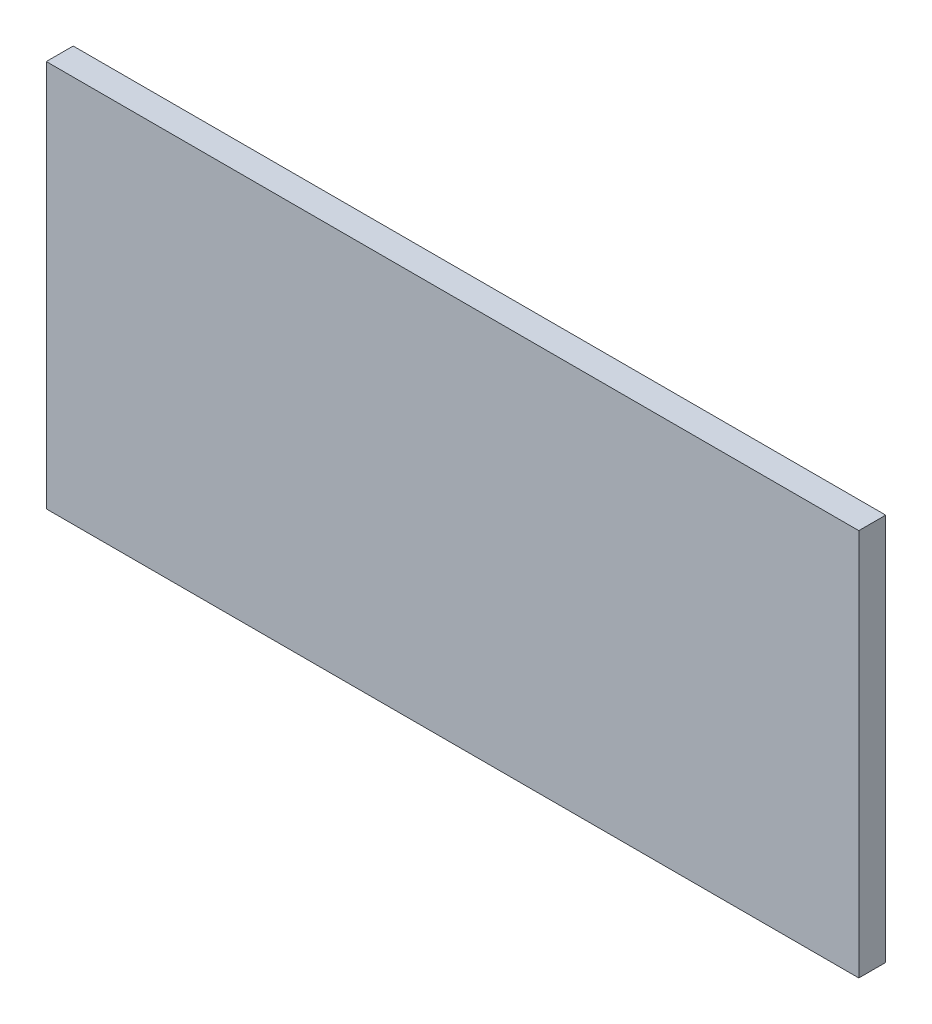
ISO-10303-21;
HEADER;
FILE_DESCRIPTION(('STEP AP214'),'2;1');
FILE_NAME('part.step','',(''),(''),'','','');
FILE_SCHEMA(('AUTOMOTIVE_DESIGN { 1 0 10303 214 1 1 1 1 }'));
ENDSEC;
DATA;
#1=APPLICATION_CONTEXT('core data for automotive mechanical design processes');
#2=APPLICATION_PROTOCOL_DEFINITION('international standard','automotive_design',2000,#1);
#3=PRODUCT_CONTEXT('',#1,'mechanical');
#4=PRODUCT('Part','Part','',(#3));
#5=PRODUCT_RELATED_PRODUCT_CATEGORY('part','',(#4));
#6=PRODUCT_DEFINITION_FORMATION('','',#4);
#7=PRODUCT_DEFINITION_CONTEXT('part definition',#1,'design');
#8=PRODUCT_DEFINITION('design','',#6,#7);
#9=PRODUCT_DEFINITION_SHAPE('','',#8);
#10=(LENGTH_UNIT() NAMED_UNIT(*) SI_UNIT(.MILLI.,.METRE.));
#11=(NAMED_UNIT(*) PLANE_ANGLE_UNIT() SI_UNIT($,.RADIAN.));
#12=(NAMED_UNIT(*) SI_UNIT($,.STERADIAN.) SOLID_ANGLE_UNIT());
#13=UNCERTAINTY_MEASURE_WITH_UNIT(LENGTH_MEASURE(1.E-05),#10,'distance_accuracy_value','');
#14=(GEOMETRIC_REPRESENTATION_CONTEXT(3) GLOBAL_UNCERTAINTY_ASSIGNED_CONTEXT((#13)) GLOBAL_UNIT_ASSIGNED_CONTEXT((#10,
#11,#12)) REPRESENTATION_CONTEXT('',''));
#15=CARTESIAN_POINT('',(0.,0.,0.));
#16=DIRECTION('',(0.,0.,1.));
#17=DIRECTION('',(1.,0.,0.));
#18=AXIS2_PLACEMENT_3D('',#15,#16,#17);
#19=CARTESIAN_POINT('',(-75.5,36.,5.));
#20=DIRECTION('',(1.,0.,0.));
#21=DIRECTION('',(0.,1.,0.));
#22=AXIS2_PLACEMENT_3D('',#19,#20,#21);
#23=PLANE('',#22);
#24=DIRECTION('',(0.,-1.,0.));
#25=VECTOR('',#24,1.);
#26=CARTESIAN_POINT('',(-75.5,36.,0.));
#27=LINE('',#26,#25);
#28=CARTESIAN_POINT('',(-75.5,36.,0.));
#29=VERTEX_POINT('',#28);
#30=CARTESIAN_POINT('',(-75.5,-36.,0.));
#31=VERTEX_POINT('',#30);
#32=EDGE_CURVE('E96',#29,#31,#27,.T.);
#33=ORIENTED_EDGE('',*,*,#32,.T.);
#34=DIRECTION('',(0.,0.,-1.));
#35=VECTOR('',#34,1.);
#36=CARTESIAN_POINT('',(-75.5,-36.,5.));
#37=LINE('',#36,#35);
#38=CARTESIAN_POINT('',(-75.5,-36.,5.));
#39=VERTEX_POINT('',#38);
#40=EDGE_CURVE('E11',#39,#31,#37,.T.);
#41=ORIENTED_EDGE('',*,*,#40,.F.);
#42=DIRECTION('',(0.,-1.,0.));
#43=VECTOR('',#42,1.);
#44=CARTESIAN_POINT('',(-75.5,36.,5.));
#45=LINE('',#44,#43);
#46=CARTESIAN_POINT('',(-75.5,36.,5.));
#47=VERTEX_POINT('',#46);
#48=EDGE_CURVE('E84',#47,#39,#45,.T.);
#49=ORIENTED_EDGE('',*,*,#48,.F.);
#50=DIRECTION('',(0.,0.,-1.));
#51=VECTOR('',#50,1.);
#52=CARTESIAN_POINT('',(-75.5,36.,5.));
#53=LINE('',#52,#51);
#54=EDGE_CURVE('E92',#47,#29,#53,.T.);
#55=ORIENTED_EDGE('',*,*,#54,.T.);
#56=EDGE_LOOP('',(#33,#41,#49,#55));
#57=FACE_BOUND('',#56,.T.);
#58=ADVANCED_FACE('F33',(#57),#23,.F.);
#59=CARTESIAN_POINT('',(-75.5,-36.,5.));
#60=DIRECTION('',(0.,1.,0.));
#61=DIRECTION('',(0.,0.,1.));
#62=AXIS2_PLACEMENT_3D('',#59,#60,#61);
#63=PLANE('',#62);
#64=DIRECTION('',(1.,0.,0.));
#65=VECTOR('',#64,1.);
#66=CARTESIAN_POINT('',(-75.5,-36.,0.));
#67=LINE('',#66,#65);
#68=CARTESIAN_POINT('',(75.5,-36.,0.));
#69=VERTEX_POINT('',#68);
#70=EDGE_CURVE('E88',#31,#69,#67,.T.);
#71=ORIENTED_EDGE('',*,*,#70,.T.);
#72=DIRECTION('',(0.,0.,-1.));
#73=VECTOR('',#72,1.);
#74=CARTESIAN_POINT('',(75.5,-36.,5.));
#75=LINE('',#74,#73);
#76=CARTESIAN_POINT('',(75.5,-36.,5.));
#77=VERTEX_POINT('',#76);
#78=EDGE_CURVE('E41',#77,#69,#75,.T.);
#79=ORIENTED_EDGE('',*,*,#78,.F.);
#80=DIRECTION('',(1.,0.,0.));
#81=VECTOR('',#80,1.);
#82=CARTESIAN_POINT('',(-75.5,-36.,5.));
#83=LINE('',#82,#81);
#84=EDGE_CURVE('E79',#39,#77,#83,.T.);
#85=ORIENTED_EDGE('',*,*,#84,.F.);
#86=ORIENTED_EDGE('',*,*,#40,.T.);
#87=EDGE_LOOP('',(#71,#79,#85,#86));
#88=FACE_BOUND('',#87,.T.);
#89=ADVANCED_FACE('F87',(#88),#63,.F.);
#90=CARTESIAN_POINT('',(75.5,36.,5.));
#91=DIRECTION('',(-1.,0.,0.));
#92=DIRECTION('',(0.,-1.,0.));
#93=AXIS2_PLACEMENT_3D('',#90,#91,#92);
#94=PLANE('',#93);
#95=DIRECTION('',(0.,1.,0.));
#96=VECTOR('',#95,1.);
#97=CARTESIAN_POINT('',(75.5,36.,0.));
#98=LINE('',#97,#96);
#99=CARTESIAN_POINT('',(75.5,36.,0.));
#100=VERTEX_POINT('',#99);
#101=EDGE_CURVE('E66',#69,#100,#98,.T.);
#102=ORIENTED_EDGE('',*,*,#101,.T.);
#103=DIRECTION('',(0.,0.,-1.));
#104=VECTOR('',#103,1.);
#105=CARTESIAN_POINT('',(75.5,36.,5.));
#106=LINE('',#105,#104);
#107=CARTESIAN_POINT('',(75.5,36.,5.));
#108=VERTEX_POINT('',#107);
#109=EDGE_CURVE('E89',#108,#100,#106,.T.);
#110=ORIENTED_EDGE('',*,*,#109,.F.);
#111=DIRECTION('',(0.,1.,0.));
#112=VECTOR('',#111,1.);
#113=CARTESIAN_POINT('',(75.5,36.,5.));
#114=LINE('',#113,#112);
#115=EDGE_CURVE('E82',#77,#108,#114,.T.);
#116=ORIENTED_EDGE('',*,*,#115,.F.);
#117=ORIENTED_EDGE('',*,*,#78,.T.);
#118=EDGE_LOOP('',(#102,#110,#116,#117));
#119=FACE_BOUND('',#118,.T.);
#120=ADVANCED_FACE('F90',(#119),#94,.F.);
#121=CARTESIAN_POINT('',(-75.5,36.,5.));
#122=DIRECTION('',(0.,-1.,0.));
#123=DIRECTION('',(0.,0.,-1.));
#124=AXIS2_PLACEMENT_3D('',#121,#122,#123);
#125=PLANE('',#124);
#126=DIRECTION('',(-1.,0.,0.));
#127=VECTOR('',#126,1.);
#128=CARTESIAN_POINT('',(-75.5,36.,0.));
#129=LINE('',#128,#127);
#130=EDGE_CURVE('E72',#100,#29,#129,.T.);
#131=ORIENTED_EDGE('',*,*,#130,.T.);
#132=ORIENTED_EDGE('',*,*,#54,.F.);
#133=DIRECTION('',(-1.,0.,0.));
#134=VECTOR('',#133,1.);
#135=CARTESIAN_POINT('',(-75.5,36.,5.));
#136=LINE('',#135,#134);
#137=EDGE_CURVE('E49',#108,#47,#136,.T.);
#138=ORIENTED_EDGE('',*,*,#137,.F.);
#139=ORIENTED_EDGE('',*,*,#109,.T.);
#140=EDGE_LOOP('',(#131,#132,#138,#139));
#141=FACE_BOUND('',#140,.T.);
#142=ADVANCED_FACE('F103',(#141),#125,.F.);
#143=CARTESIAN_POINT('',(0.,0.,5.));
#144=DIRECTION('',(0.,0.,1.));
#145=DIRECTION('',(1.,0.,0.));
#146=AXIS2_PLACEMENT_3D('',#143,#144,#145);
#147=PLANE('',#146);
#148=ORIENTED_EDGE('',*,*,#48,.T.);
#149=ORIENTED_EDGE('',*,*,#84,.T.);
#150=ORIENTED_EDGE('',*,*,#115,.T.);
#151=ORIENTED_EDGE('',*,*,#137,.T.);
#152=EDGE_LOOP('',(#148,#149,#150,#151));
#153=FACE_BOUND('',#152,.T.);
#154=ADVANCED_FACE('F80',(#153),#147,.T.);
#155=CARTESIAN_POINT('',(0.,0.,0.));
#156=DIRECTION('',(0.,0.,1.));
#157=DIRECTION('',(1.,0.,0.));
#158=AXIS2_PLACEMENT_3D('',#155,#156,#157);
#159=PLANE('',#158);
#160=ORIENTED_EDGE('',*,*,#32,.F.);
#161=ORIENTED_EDGE('',*,*,#130,.F.);
#162=ORIENTED_EDGE('',*,*,#101,.F.);
#163=ORIENTED_EDGE('',*,*,#70,.F.);
#164=EDGE_LOOP('',(#160,#161,#162,#163));
#165=FACE_BOUND('',#164,.T.);
#166=ADVANCED_FACE('F106',(#165),#159,.F.);
#167=CLOSED_SHELL('',(#58,#89,#120,#142,#154,#166));
#168=MANIFOLD_SOLID_BREP('B2',#167);
#169=ADVANCED_BREP_SHAPE_REPRESENTATION('',(#18,#168),#14);
#170=SHAPE_DEFINITION_REPRESENTATION(#9,#169);
ENDSEC;
END-ISO-10303-21;
